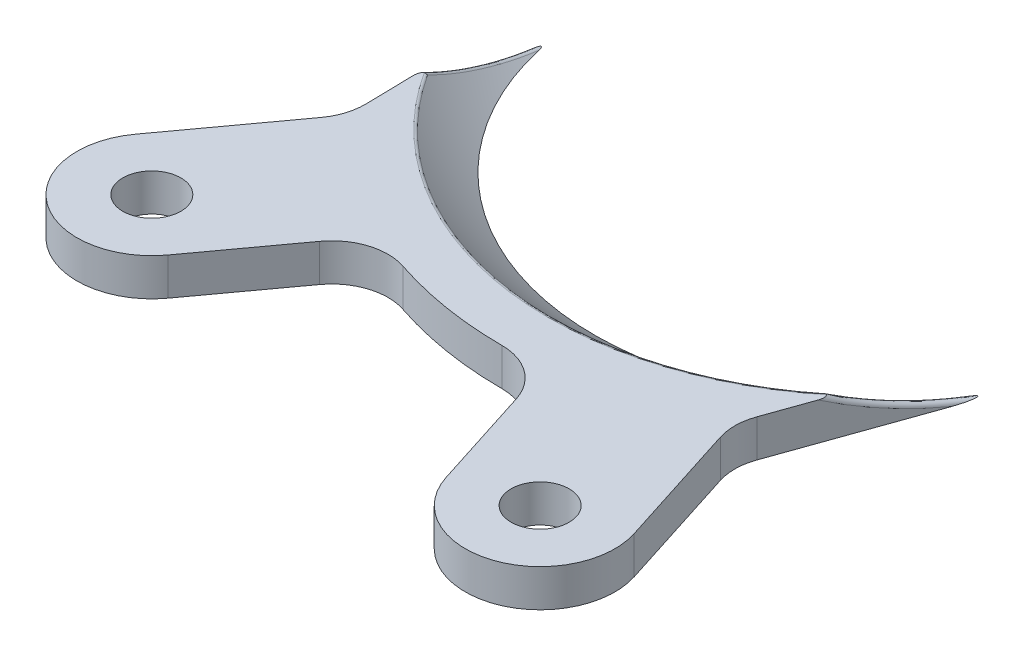
ISO-10303-21;
HEADER;
FILE_DESCRIPTION(('STEP AP214'),'2;1');
FILE_NAME('part.step','',(''),(''),'','','');
FILE_SCHEMA(('AUTOMOTIVE_DESIGN { 1 0 10303 214 1 1 1 1 }'));
ENDSEC;
DATA;
#1=APPLICATION_CONTEXT('core data for automotive mechanical design processes');
#2=APPLICATION_PROTOCOL_DEFINITION('international standard','automotive_design',2000,#1);
#3=PRODUCT_CONTEXT('',#1,'mechanical');
#4=PRODUCT('Part','Part','',(#3));
#5=PRODUCT_RELATED_PRODUCT_CATEGORY('part','',(#4));
#6=PRODUCT_DEFINITION_FORMATION('','',#4);
#7=PRODUCT_DEFINITION_CONTEXT('part definition',#1,'design');
#8=PRODUCT_DEFINITION('design','',#6,#7);
#9=PRODUCT_DEFINITION_SHAPE('','',#8);
#10=(LENGTH_UNIT() NAMED_UNIT(*) SI_UNIT(.MILLI.,.METRE.));
#11=(NAMED_UNIT(*) PLANE_ANGLE_UNIT() SI_UNIT($,.RADIAN.));
#12=(NAMED_UNIT(*) SI_UNIT($,.STERADIAN.) SOLID_ANGLE_UNIT());
#13=UNCERTAINTY_MEASURE_WITH_UNIT(LENGTH_MEASURE(1.E-05),#10,'distance_accuracy_value','');
#14=(GEOMETRIC_REPRESENTATION_CONTEXT(3) GLOBAL_UNCERTAINTY_ASSIGNED_CONTEXT((#13)) GLOBAL_UNIT_ASSIGNED_CONTEXT((#10,
#11,#12)) REPRESENTATION_CONTEXT('',''));
#15=CARTESIAN_POINT('',(0.,0.,0.));
#16=DIRECTION('',(0.,0.,1.));
#17=DIRECTION('',(1.,0.,0.));
#18=AXIS2_PLACEMENT_3D('',#15,#16,#17);
#19=CARTESIAN_POINT('',(-11.920981795953,2.,-8.70254765488495));
#20=DIRECTION('',(0.807679539292025,0.,0.589621710768033));
#21=DIRECTION('',(0.589621710768033,0.,-0.807679539292026));
#22=AXIS2_PLACEMENT_3D('',#19,#20,#21);
#23=PLANE('',#22);
#24=DIRECTION('',(-0.589621710768033,0.,0.807679539292026));
#25=VECTOR('',#24,1.);
#26=CARTESIAN_POINT('',(-11.920981795953,2.,-8.70254765488495));
#27=LINE('',#26,#25);
#28=CARTESIAN_POINT('',(-10.0241295132366,2.,-11.3009064836563));
#29=VERTEX_POINT('',#28);
#30=CARTESIAN_POINT('',(-14.2059725719786,2.,-5.57250636983299));
#31=VERTEX_POINT('',#30);
#32=EDGE_CURVE('E182',#29,#31,#27,.T.);
#33=ORIENTED_EDGE('',*,*,#32,.F.);
#34=DIRECTION('',(0.,-1.,0.));
#35=VECTOR('',#34,1.);
#36=CARTESIAN_POINT('',(-10.0241295132366,2.,-11.3009064836563));
#37=LINE('',#36,#35);
#38=CARTESIAN_POINT('',(-10.0241295132366,0.,-11.3009064836563));
#39=VERTEX_POINT('',#38);
#40=EDGE_CURVE('E213',#29,#39,#37,.T.);
#41=ORIENTED_EDGE('',*,*,#40,.T.);
#42=DIRECTION('',(-0.589621710768033,0.,0.807679539292026));
#43=VECTOR('',#42,1.);
#44=CARTESIAN_POINT('',(-11.920981795953,0.,-8.70254765488495));
#45=LINE('',#44,#43);
#46=CARTESIAN_POINT('',(-14.2059725719786,0.,-5.57250636983299));
#47=VERTEX_POINT('',#46);
#48=EDGE_CURVE('E210',#39,#47,#45,.T.);
#49=ORIENTED_EDGE('',*,*,#48,.T.);
#50=DIRECTION('',(0.,-1.,0.));
#51=VECTOR('',#50,1.);
#52=CARTESIAN_POINT('',(-14.2059725719786,2.,-5.57250636983299));
#53=LINE('',#52,#51);
#54=EDGE_CURVE('E202',#31,#47,#53,.T.);
#55=ORIENTED_EDGE('',*,*,#54,.F.);
#56=EDGE_LOOP('',(#33,#41,#49,#55));
#57=FACE_BOUND('',#56,.T.);
#58=ADVANCED_FACE('F53',(#57),#23,.F.);
#59=CARTESIAN_POINT('',(-10.9752544148105,2.,-3.21401952676085));
#60=DIRECTION('',(0.,-1.,0.));
#61=DIRECTION('',(0.,0.,-1.));
#62=AXIS2_PLACEMENT_3D('',#59,#60,#61);
#63=CYLINDRICAL_SURFACE('',#62,4.00000000000001);
#64=CARTESIAN_POINT('',(-10.9752544148105,0.,-3.21401952676085));
#65=DIRECTION('',(0.,1.,0.));
#66=DIRECTION('',(0.,0.,1.));
#67=AXIS2_PLACEMENT_3D('',#64,#65,#66);
#68=CIRCLE('',#67,4.00000000000001);
#69=CARTESIAN_POINT('',(-7.74453625764238,0.,-0.855532683688701));
#70=VERTEX_POINT('',#69);
#71=EDGE_CURVE('E441',#47,#70,#68,.T.);
#72=ORIENTED_EDGE('',*,*,#71,.T.);
#73=DIRECTION('',(0.,-1.,0.));
#74=VECTOR('',#73,1.);
#75=CARTESIAN_POINT('',(-7.74453625764238,2.,-0.855532683688701));
#76=LINE('',#75,#74);
#77=CARTESIAN_POINT('',(-7.74453625764238,2.,-0.855532683688701));
#78=VERTEX_POINT('',#77);
#79=EDGE_CURVE('E204',#78,#70,#76,.T.);
#80=ORIENTED_EDGE('',*,*,#79,.F.);
#81=CARTESIAN_POINT('',(-10.9752544148105,2.,-3.21401952676085));
#82=DIRECTION('',(0.,1.,0.));
#83=DIRECTION('',(0.,0.,1.));
#84=AXIS2_PLACEMENT_3D('',#81,#82,#83);
#85=CIRCLE('',#84,4.00000000000001);
#86=EDGE_CURVE('E187',#31,#78,#85,.T.);
#87=ORIENTED_EDGE('',*,*,#86,.F.);
#88=ORIENTED_EDGE('',*,*,#54,.T.);
#89=EDGE_LOOP('',(#72,#80,#87,#88));
#90=FACE_BOUND('',#89,.T.);
#91=ADVANCED_FACE('F201',(#90),#63,.T.);
#92=CARTESIAN_POINT('',(-5.45954548161673,2.,-3.98557396874065));
#93=DIRECTION('',(-0.807679539292025,0.,-0.589621710768033));
#94=DIRECTION('',(-0.589621710768033,0.,0.807679539292025));
#95=AXIS2_PLACEMENT_3D('',#92,#93,#94);
#96=PLANE('',#95);
#97=DIRECTION('',(0.589621710768033,0.,-0.807679539292025));
#98=VECTOR('',#97,1.);
#99=CARTESIAN_POINT('',(-5.45954548161673,0.,-3.98557396874065));
#100=LINE('',#99,#98);
#101=CARTESIAN_POINT('',(-4.32997932465112,0.,-5.53288380587244));
#102=VERTEX_POINT('',#101);
#103=EDGE_CURVE('E404',#70,#102,#100,.T.);
#104=ORIENTED_EDGE('',*,*,#103,.T.);
#105=DIRECTION('',(0.,1.,0.));
#106=VECTOR('',#105,1.);
#107=CARTESIAN_POINT('',(-4.32997932465112,2.,-5.53288380587244));
#108=LINE('',#107,#106);
#109=CARTESIAN_POINT('',(-4.32997932465112,2.,-5.53288380587244));
#110=VERTEX_POINT('',#109);
#111=EDGE_CURVE('E243',#102,#110,#108,.T.);
#112=ORIENTED_EDGE('',*,*,#111,.T.);
#113=DIRECTION('',(0.589621710768033,0.,-0.807679539292025));
#114=VECTOR('',#113,1.);
#115=CARTESIAN_POINT('',(-5.45954548161673,2.,-3.98557396874065));
#116=LINE('',#115,#114);
#117=EDGE_CURVE('E207',#78,#110,#116,.T.);
#118=ORIENTED_EDGE('',*,*,#117,.F.);
#119=ORIENTED_EDGE('',*,*,#79,.T.);
#120=EDGE_LOOP('',(#104,#112,#118,#119));
#121=FACE_BOUND('',#120,.T.);
#122=ADVANCED_FACE('F448',(#121),#96,.F.);
#123=CARTESIAN_POINT('',(5.35726697347827,2.,-25.5867427651695));
#124=DIRECTION('',(0.,-1.,0.));
#125=DIRECTION('',(0.,0.,-1.));
#126=AXIS2_PLACEMENT_3D('',#123,#124,#125);
#127=CYLINDRICAL_SURFACE('',#126,20.);
#128=CARTESIAN_POINT('',(5.35726697347827,0.,-25.5867427651695));
#129=DIRECTION('',(0.,1.,0.));
#130=DIRECTION('',(0.,0.,1.));
#131=AXIS2_PLACEMENT_3D('',#128,#129,#130);
#132=CIRCLE('',#131,20.);
#133=CARTESIAN_POINT('',(-0.959435357176782,0.,-6.61046094638588));
#134=VERTEX_POINT('',#133);
#135=CARTESIAN_POINT('',(5.35473098050555,0.,-5.58674292595099));
#136=VERTEX_POINT('',#135);
#137=EDGE_CURVE('E400',#134,#136,#132,.T.);
#138=ORIENTED_EDGE('',*,*,#137,.T.);
#139=DIRECTION('',(0.,-1.,0.));
#140=VECTOR('',#139,1.);
#141=CARTESIAN_POINT('',(5.35473098050555,2.,-5.58674292595099));
#142=LINE('',#141,#140);
#143=CARTESIAN_POINT('',(5.35473098050555,2.,-5.58674292595099));
#144=VERTEX_POINT('',#143);
#145=EDGE_CURVE('E240',#136,#144,#142,.F.);
#146=ORIENTED_EDGE('',*,*,#145,.T.);
#147=CARTESIAN_POINT('',(5.35726697347827,2.,-25.5867427651695));
#148=DIRECTION('',(0.,1.,0.));
#149=DIRECTION('',(0.,0.,1.));
#150=AXIS2_PLACEMENT_3D('',#147,#148,#149);
#151=CIRCLE('',#150,20.);
#152=CARTESIAN_POINT('',(-0.959435357176782,2.,-6.61046094638588));
#153=VERTEX_POINT('',#152);
#154=EDGE_CURVE('E454',#153,#144,#151,.T.);
#155=ORIENTED_EDGE('',*,*,#154,.F.);
#156=DIRECTION('',(0.,-1.,0.));
#157=VECTOR('',#156,1.);
#158=CARTESIAN_POINT('',(-0.959435357176783,2.,-6.61046094638587));
#159=LINE('',#158,#157);
#160=EDGE_CURVE('E236',#153,#134,#159,.T.);
#161=ORIENTED_EDGE('',*,*,#160,.T.);
#162=EDGE_LOOP('',(#138,#146,#155,#161));
#163=FACE_BOUND('',#162,.T.);
#164=ADVANCED_FACE('F457',(#163),#127,.T.);
#165=CARTESIAN_POINT('',(8.46623721619208,2.,-2.70382058589086));
#166=DIRECTION('',(-0.952599553113903,0.,0.304227039244038));
#167=DIRECTION('',(0.304227039244038,0.,0.952599553113903));
#168=AXIS2_PLACEMENT_3D('',#165,#166,#167);
#169=PLANE('',#168);
#170=DIRECTION('',(-0.304227039244038,0.,-0.952599553113902));
#171=VECTOR('',#170,1.);
#172=CARTESIAN_POINT('',(8.46623721619208,2.,-2.70382058589086));
#173=LINE('',#172,#171);
#174=CARTESIAN_POINT('',(9.97395774809266,2.,2.01717301309372));
#175=VERTEX_POINT('',#174);
#176=CARTESIAN_POINT('',(8.21214924090135,2.,-3.49942406780033));
#177=VERTEX_POINT('',#176);
#178=EDGE_CURVE('E461',#175,#177,#173,.T.);
#179=ORIENTED_EDGE('',*,*,#178,.T.);
#180=DIRECTION('',(0.,-1.,0.));
#181=VECTOR('',#180,1.);
#182=CARTESIAN_POINT('',(8.21214924090135,2.,-3.49942406780033));
#183=LINE('',#182,#181);
#184=CARTESIAN_POINT('',(8.21214924090135,0.,-3.49942406780033));
#185=VERTEX_POINT('',#184);
#186=EDGE_CURVE('E232',#177,#185,#183,.T.);
#187=ORIENTED_EDGE('',*,*,#186,.T.);
#188=DIRECTION('',(-0.304227039244038,0.,-0.952599553113902));
#189=VECTOR('',#188,1.);
#190=CARTESIAN_POINT('',(8.46623721619208,0.,-2.70382058589086));
#191=LINE('',#190,#189);
#192=CARTESIAN_POINT('',(9.97395774809266,0.,2.01717301309372));
#193=VERTEX_POINT('',#192);
#194=EDGE_CURVE('E393',#193,#185,#191,.T.);
#195=ORIENTED_EDGE('',*,*,#194,.F.);
#196=DIRECTION('',(0.,-1.,0.));
#197=VECTOR('',#196,1.);
#198=CARTESIAN_POINT('',(9.97395774809266,2.,2.01717301309372));
#199=LINE('',#198,#197);
#200=EDGE_CURVE('E219',#175,#193,#199,.T.);
#201=ORIENTED_EDGE('',*,*,#200,.F.);
#202=EDGE_LOOP('',(#179,#187,#195,#201));
#203=FACE_BOUND('',#202,.T.);
#204=ADVANCED_FACE('F397',(#203),#169,.T.);
#205=CARTESIAN_POINT('',(13.7843559605483,2.,0.800264856117561));
#206=DIRECTION('',(0.,-1.,0.));
#207=DIRECTION('',(0.,0.,-1.));
#208=AXIS2_PLACEMENT_3D('',#205,#206,#207);
#209=CYLINDRICAL_SURFACE('',#208,4.00000000000002);
#210=CARTESIAN_POINT('',(13.7843559605483,0.,0.800264856117561));
#211=DIRECTION('',(0.,1.,0.));
#212=DIRECTION('',(0.,0.,1.));
#213=AXIS2_PLACEMENT_3D('',#210,#211,#212);
#214=CIRCLE('',#213,4.00000000000002);
#215=CARTESIAN_POINT('',(17.5947541730039,0.,-0.416643300858593));
#216=VERTEX_POINT('',#215);
#217=EDGE_CURVE('E385',#193,#216,#214,.T.);
#218=ORIENTED_EDGE('',*,*,#217,.T.);
#219=DIRECTION('',(0.,-1.,0.));
#220=VECTOR('',#219,1.);
#221=CARTESIAN_POINT('',(17.5947541730039,2.,-0.416643300858593));
#222=LINE('',#221,#220);
#223=CARTESIAN_POINT('',(17.5947541730039,2.,-0.416643300858593));
#224=VERTEX_POINT('',#223);
#225=EDGE_CURVE('E375',#224,#216,#222,.T.);
#226=ORIENTED_EDGE('',*,*,#225,.F.);
#227=CARTESIAN_POINT('',(13.7843559605483,2.,0.800264856117561));
#228=DIRECTION('',(0.,1.,0.));
#229=DIRECTION('',(0.,0.,1.));
#230=AXIS2_PLACEMENT_3D('',#227,#228,#229);
#231=CIRCLE('',#230,4.00000000000002);
#232=EDGE_CURVE('E386',#175,#224,#231,.T.);
#233=ORIENTED_EDGE('',*,*,#232,.F.);
#234=ORIENTED_EDGE('',*,*,#200,.T.);
#235=EDGE_LOOP('',(#218,#226,#233,#234));
#236=FACE_BOUND('',#235,.T.);
#237=ADVANCED_FACE('F383',(#236),#209,.T.);
#238=CARTESIAN_POINT('',(16.0870336411034,2.,-5.13763689984319));
#239=DIRECTION('',(-0.952599553113902,0.,0.304227039244038));
#240=DIRECTION('',(0.304227039244038,0.,0.952599553113902));
#241=AXIS2_PLACEMENT_3D('',#238,#239,#240);
#242=PLANE('',#241);
#243=DIRECTION('',(-0.304227039244038,0.,-0.952599553113903));
#244=VECTOR('',#243,1.);
#245=CARTESIAN_POINT('',(16.0870336411034,0.,-5.13763689984319));
#246=LINE('',#245,#244);
#247=CARTESIAN_POINT('',(15.437049140927,0.,-7.17287658773398));
#248=VERTEX_POINT('',#247);
#249=EDGE_CURVE('E365',#216,#248,#246,.T.);
#250=ORIENTED_EDGE('',*,*,#249,.T.);
#251=DIRECTION('',(0.,-1.,0.));
#252=VECTOR('',#251,1.);
#253=CARTESIAN_POINT('',(15.437049140927,2.,-7.17287658773397));
#254=LINE('',#253,#252);
#255=CARTESIAN_POINT('',(15.437049140927,2.,-7.17287658773398));
#256=VERTEX_POINT('',#255);
#257=EDGE_CURVE('E229',#248,#256,#254,.F.);
#258=ORIENTED_EDGE('',*,*,#257,.T.);
#259=DIRECTION('',(-0.304227039244038,0.,-0.952599553113903));
#260=VECTOR('',#259,1.);
#261=CARTESIAN_POINT('',(16.0870336411034,2.,-5.13763689984319));
#262=LINE('',#261,#260);
#263=EDGE_CURVE('E419',#224,#256,#262,.T.);
#264=ORIENTED_EDGE('',*,*,#263,.F.);
#265=ORIENTED_EDGE('',*,*,#225,.T.);
#266=EDGE_LOOP('',(#250,#258,#264,#265));
#267=FACE_BOUND('',#266,.T.);
#268=ADVANCED_FACE('F410',(#267),#242,.F.);
#269=CARTESIAN_POINT('',(10.8669421285882,2.,3.86073627490867));
#270=DIRECTION('',(-0.942298562553958,0.,-0.334773683267881));
#271=DIRECTION('',(-0.334773683267881,0.,0.942298562553959));
#272=AXIS2_PLACEMENT_3D('',#269,#270,#271);
#273=PLANE('',#272);
#274=DIRECTION('',(0.334773683267881,0.,-0.942298562553959));
#275=VECTOR('',#274,1.);
#276=CARTESIAN_POINT('',(10.8669421285882,0.,3.86073627490867));
#277=LINE('',#276,#275);
#278=CARTESIAN_POINT('',(15.4679521126068,0.,-9.08987875526974));
#279=VERTEX_POINT('',#278);
#280=CARTESIAN_POINT('',(18.1984266465281,0.,-16.7754357658709));
#281=VERTEX_POINT('',#280);
#282=EDGE_CURVE('E359',#279,#281,#277,.T.);
#283=ORIENTED_EDGE('',*,*,#282,.T.);
#284=CARTESIAN_POINT('',(19.5388603399153,20.,-20.5483988319879));
#285=DIRECTION('',(-0.942298562553958,0.,-0.334773683267881));
#286=DIRECTION('',(-0.334773683267881,0.,0.942298562553959));
#287=AXIS2_PLACEMENT_3D('',#284,#285,#286);
#288=CIRCLE('',#287,20.3968628172239);
#289=CARTESIAN_POINT('',(16.3272653575068,2.,-11.5086161767679));
#290=VERTEX_POINT('',#289);
#291=EDGE_CURVE('E11',#281,#290,#288,.T.);
#292=ORIENTED_EDGE('',*,*,#291,.T.);
#293=DIRECTION('',(0.334773683267881,0.,-0.942298562553959));
#294=VECTOR('',#293,1.);
#295=CARTESIAN_POINT('',(10.8669421285882,2.,3.86073627490867));
#296=LINE('',#295,#294);
#297=CARTESIAN_POINT('',(15.4679521126068,2.,-9.08987875526974));
#298=VERTEX_POINT('',#297);
#299=EDGE_CURVE('E418',#298,#290,#296,.T.);
#300=ORIENTED_EDGE('',*,*,#299,.F.);
#301=DIRECTION('',(0.,-1.,0.));
#302=VECTOR('',#301,1.);
#303=CARTESIAN_POINT('',(15.4679521126068,0.,-9.08987875526973));
#304=LINE('',#303,#302);
#305=EDGE_CURVE('E225',#298,#279,#304,.T.);
#306=ORIENTED_EDGE('',*,*,#305,.T.);
#307=EDGE_LOOP('',(#283,#292,#300,#306));
#308=FACE_BOUND('',#307,.T.);
#309=ADVANCED_FACE('F421',(#308),#273,.F.);
#310=CARTESIAN_POINT('',(13.7843559605483,2.,0.800264856117561));
#311=DIRECTION('',(0.,-1.,0.));
#312=DIRECTION('',(0.,0.,-1.));
#313=AXIS2_PLACEMENT_3D('',#310,#311,#312);
#314=CYLINDRICAL_SURFACE('',#313,1.55);
#315=CARTESIAN_POINT('',(13.7843559605483,2.,0.800264856117561));
#316=DIRECTION('',(0.,1.,0.));
#317=DIRECTION('',(0.,0.,1.));
#318=AXIS2_PLACEMENT_3D('',#315,#316,#317);
#319=CIRCLE('',#318,1.55);
#320=CARTESIAN_POINT('',(13.7843559605483,2.,2.35026485611756));
#321=VERTEX_POINT('',#320);
#322=EDGE_CURVE('E428',#321,#321,#319,.T.);
#323=ORIENTED_EDGE('',*,*,#322,.T.);
#324=EDGE_LOOP('',(#323));
#325=FACE_BOUND('',#324,.T.);
#326=CARTESIAN_POINT('',(13.7843559605483,0.,0.800264856117561));
#327=DIRECTION('',(0.,1.,0.));
#328=DIRECTION('',(0.,0.,1.));
#329=AXIS2_PLACEMENT_3D('',#326,#327,#328);
#330=CIRCLE('',#329,1.55);
#331=CARTESIAN_POINT('',(13.7843559605483,0.,2.35026485611756));
#332=VERTEX_POINT('',#331);
#333=EDGE_CURVE('E363',#332,#332,#330,.T.);
#334=ORIENTED_EDGE('',*,*,#333,.F.);
#335=EDGE_LOOP('',(#334));
#336=FACE_BOUND('',#335,.T.);
#337=ADVANCED_FACE('F497',(#325,#336),#314,.F.);
#338=CARTESIAN_POINT('',(-9.18279284805776,2.,0.182775951464731));
#339=DIRECTION('',(-0.999801970670517,0.,0.0199002372686941));
#340=DIRECTION('',(0.0199002372686941,0.,0.999801970670517));
#341=AXIS2_PLACEMENT_3D('',#338,#339,#340);
#342=PLANE('',#341);
#343=DIRECTION('',(-0.0199002372686941,0.,-0.999801970670517));
#344=VECTOR('',#343,1.);
#345=CARTESIAN_POINT('',(-9.18279284805776,2.,0.182775951464731));
#346=LINE('',#345,#344);
#347=CARTESIAN_POINT('',(-9.44776221910111,2.,-13.1294723277665));
#348=VERTEX_POINT('',#347);
#349=CARTESIAN_POINT('',(-9.49884310841927,2.,-15.6958122720767));
#350=VERTEX_POINT('',#349);
#351=EDGE_CURVE('E424',#348,#350,#346,.T.);
#352=ORIENTED_EDGE('',*,*,#351,.T.);
#353=CARTESIAN_POINT('',(-9.68975268511302,20.,-25.2872441942756));
#354=DIRECTION('',(-0.999801970670517,0.,0.0199002372686941));
#355=DIRECTION('',(0.0199002372686941,0.,0.999801970670517));
#356=AXIS2_PLACEMENT_3D('',#353,#354,#355);
#357=CIRCLE('',#356,20.3968628172239);
#358=CARTESIAN_POINT('',(-9.61007214307945,0.,-21.2840375051486));
#359=VERTEX_POINT('',#358);
#360=EDGE_CURVE('E84',#350,#359,#357,.F.);
#361=ORIENTED_EDGE('',*,*,#360,.T.);
#362=DIRECTION('',(-0.0199002372686941,0.,-0.999801970670517));
#363=VECTOR('',#362,1.);
#364=CARTESIAN_POINT('',(-9.18279284805776,0.,0.182775951464731));
#365=LINE('',#364,#363);
#366=CARTESIAN_POINT('',(-9.44776221910111,0.,-13.1294723277665));
#367=VERTEX_POINT('',#366);
#368=EDGE_CURVE('E355',#367,#359,#365,.T.);
#369=ORIENTED_EDGE('',*,*,#368,.F.);
#370=DIRECTION('',(0.,-1.,0.));
#371=VECTOR('',#370,1.);
#372=CARTESIAN_POINT('',(-9.44776221910111,2.,-13.1294723277665));
#373=LINE('',#372,#371);
#374=EDGE_CURVE('E217',#367,#348,#373,.F.);
#375=ORIENTED_EDGE('',*,*,#374,.T.);
#376=EDGE_LOOP('',(#352,#361,#369,#375));
#377=FACE_BOUND('',#376,.T.);
#378=ADVANCED_FACE('F495',(#377),#342,.T.);
#379=CARTESIAN_POINT('',(-10.9752544148105,2.,-3.21401952676085));
#380=DIRECTION('',(0.,-1.,0.));
#381=DIRECTION('',(0.,0.,-1.));
#382=AXIS2_PLACEMENT_3D('',#379,#380,#381);
#383=CYLINDRICAL_SURFACE('',#382,1.55);
#384=CARTESIAN_POINT('',(-10.9752544148105,2.,-3.21401952676085));
#385=DIRECTION('',(0.,1.,0.));
#386=DIRECTION('',(0.,0.,1.));
#387=AXIS2_PLACEMENT_3D('',#384,#385,#386);
#388=CIRCLE('',#387,1.55);
#389=CARTESIAN_POINT('',(-10.9752544148105,2.,-1.66401952676085));
#390=VERTEX_POINT('',#389);
#391=EDGE_CURVE('E378',#390,#390,#388,.T.);
#392=ORIENTED_EDGE('',*,*,#391,.T.);
#393=EDGE_LOOP('',(#392));
#394=FACE_BOUND('',#393,.T.);
#395=CARTESIAN_POINT('',(-10.9752544148105,0.,-3.21401952676085));
#396=DIRECTION('',(0.,1.,0.));
#397=DIRECTION('',(0.,0.,1.));
#398=AXIS2_PLACEMENT_3D('',#395,#396,#397);
#399=CIRCLE('',#398,1.55);
#400=CARTESIAN_POINT('',(-10.9752544148105,0.,-1.66401952676085));
#401=VERTEX_POINT('',#400);
#402=EDGE_CURVE('E197',#401,#401,#399,.T.);
#403=ORIENTED_EDGE('',*,*,#402,.F.);
#404=EDGE_LOOP('',(#403));
#405=FACE_BOUND('',#404,.T.);
#406=ADVANCED_FACE('F294',(#394,#405),#383,.F.);
#407=CARTESIAN_POINT('',(0.,2.,0.));
#408=DIRECTION('',(0.,1.,0.));
#409=DIRECTION('',(0.,0.,1.));
#410=AXIS2_PLACEMENT_3D('',#407,#408,#409);
#411=PLANE('',#410);
#412=CARTESIAN_POINT('',(5.35726697347827,2.,-25.5867427651695));
#413=DIRECTION('',(0.,1.,0.));
#414=DIRECTION('',(0.,0.,1.));
#415=AXIS2_PLACEMENT_3D('',#412,#413,#414);
#416=CIRCLE('',#415,17.4732513512698);
#417=CARTESIAN_POINT('',(16.3078759594765,2.,-11.9706245363781));
#418=VERTEX_POINT('',#417);
#419=CARTESIAN_POINT('',(-9.3344729041808,2.,-16.1280276224108));
#420=VERTEX_POINT('',#419);
#421=EDGE_CURVE('E287',#418,#420,#416,.F.);
#422=ORIENTED_EDGE('',*,*,#421,.T.);
#423=CARTESIAN_POINT('',(-9.33447290418082,2.,-16.1280276224107));
#424=CARTESIAN_POINT('',(-9.34141527698466,2.,-16.1257873859322));
#425=CARTESIAN_POINT('',(-9.34805630452247,2.,-16.1228104214461));
#426=CARTESIAN_POINT('',(-9.36061396150703,2.,-16.1157756382995));
#427=CARTESIAN_POINT('',(-9.36654019567871,2.,-16.1117352249369));
#428=CARTESIAN_POINT('',(-9.38043844353494,2.,-16.1007634159035));
#429=CARTESIAN_POINT('',(-9.38803814579231,2.,-16.0933722682942));
#430=CARTESIAN_POINT('',(-9.40210676357205,2.,-16.0775082286985));
#431=CARTESIAN_POINT('',(-9.40856540549543,2.,-16.0690265903809));
#432=CARTESIAN_POINT('',(-9.42594325555545,2.,-16.0433948494577));
#433=CARTESIAN_POINT('',(-9.43557252912392,2.,-16.0253806907412));
#434=CARTESIAN_POINT('',(-9.45230896759749,2.,-15.9882194492302));
#435=CARTESIAN_POINT('',(-9.45940690317655,2.,-15.9690685117197));
#436=CARTESIAN_POINT('',(-9.47200842894899,2.,-15.9288962458683));
#437=CARTESIAN_POINT('',(-9.47737979208243,2.,-15.9078339172087));
#438=CARTESIAN_POINT('',(-9.48625727690297,2.,-15.8652969774722));
#439=CARTESIAN_POINT('',(-9.48976035203805,2.,-15.8438217518073));
#440=CARTESIAN_POINT('',(-9.49502755155161,2.,-15.8012509548801));
#441=CARTESIAN_POINT('',(-9.49683603017613,2.,-15.7801607664213));
#442=CARTESIAN_POINT('',(-9.49894424949254,2.,-15.7379778622413));
#443=CARTESIAN_POINT('',(-9.49924922331218,2.,-15.716885411187));
#444=CARTESIAN_POINT('',(-9.49884310841927,2.,-15.6958122720767));
#445=B_SPLINE_CURVE_WITH_KNOTS('',3,(#423,#424,#425,#426,#427,#428,#429,#430,#431,#432,#433,
#434,#435,#436,#437,#438,#439,#440,#441,#442,#443,#444),.UNSPECIFIED.,.F.,.F.,(4,2,2,2,2,2,2,2,
2,2,4),(0.,0.0217537107381088,0.0431714102594458,0.0748039163929338,0.106708130038567,
0.167648014139011,0.228807868273761,0.293909184404337,0.359116336886793,0.422564734080327,
0.485792134878997),.UNSPECIFIED.);
#446=EDGE_CURVE('E300',#420,#350,#445,.T.);
#447=ORIENTED_EDGE('',*,*,#446,.T.);
#448=ORIENTED_EDGE('',*,*,#351,.F.);
#449=CARTESIAN_POINT('',(-12.4471681311127,2.,-13.0697716159604));
#450=DIRECTION('',(0.,1.,0.));
#451=DIRECTION('',(0.,0.,1.));
#452=AXIS2_PLACEMENT_3D('',#449,#450,#451);
#453=CIRCLE('',#452,3.);
#454=EDGE_CURVE('E191',#348,#29,#453,.F.);
#455=ORIENTED_EDGE('',*,*,#454,.T.);
#456=ORIENTED_EDGE('',*,*,#32,.T.);
#457=ORIENTED_EDGE('',*,*,#86,.T.);
#458=ORIENTED_EDGE('',*,*,#117,.T.);
#459=CARTESIAN_POINT('',(-1.90694070677504,2.,-3.76401867356834));
#460=DIRECTION('',(0.,1.,0.));
#461=DIRECTION('',(0.,0.,1.));
#462=AXIS2_PLACEMENT_3D('',#459,#460,#461);
#463=CIRCLE('',#462,3.);
#464=EDGE_CURVE('E266',#110,#153,#463,.F.);
#465=ORIENTED_EDGE('',*,*,#464,.T.);
#466=ORIENTED_EDGE('',*,*,#154,.T.);
#467=CARTESIAN_POINT('',(5.35435058155964,2.,-2.58674295006821));
#468=DIRECTION('',(0.,1.,0.));
#469=DIRECTION('',(0.,0.,1.));
#470=AXIS2_PLACEMENT_3D('',#467,#468,#469);
#471=CIRCLE('',#470,3.);
#472=EDGE_CURVE('E260',#144,#177,#471,.F.);
#473=ORIENTED_EDGE('',*,*,#472,.T.);
#474=ORIENTED_EDGE('',*,*,#178,.F.);
#475=ORIENTED_EDGE('',*,*,#232,.T.);
#476=ORIENTED_EDGE('',*,*,#263,.T.);
#477=CARTESIAN_POINT('',(18.2948478002687,2.,-8.08555770546609));
#478=DIRECTION('',(0.,1.,0.));
#479=DIRECTION('',(0.,0.,1.));
#480=AXIS2_PLACEMENT_3D('',#477,#478,#479);
#481=CIRCLE('',#480,3.);
#482=EDGE_CURVE('E254',#256,#298,#481,.F.);
#483=ORIENTED_EDGE('',*,*,#482,.T.);
#484=ORIENTED_EDGE('',*,*,#299,.T.);
#485=CARTESIAN_POINT('',(16.3272653575068,1.99999999999994,-11.5086161767679));
#486=CARTESIAN_POINT('',(16.3351520197515,1.99999999999998,-11.5308800192846));
#487=CARTESIAN_POINT('',(16.3422093815723,1.99999999999999,-11.5534501469463));
#488=CARTESIAN_POINT('',(16.3545342080895,2.00000000000001,-11.5992170312906));
#489=CARTESIAN_POINT('',(16.3597907165364,2.,-11.6224167281532));
#490=CARTESIAN_POINT('',(16.3682932895891,2.,-11.6692381530195));
#491=CARTESIAN_POINT('',(16.371534983953,2.,-11.6928606848699));
#492=CARTESIAN_POINT('',(16.3755894937381,2.,-11.7402764787916));
#493=CARTESIAN_POINT('',(16.3764090523162,2.,-11.7640690816718));
#494=CARTESIAN_POINT('',(16.3752096701748,2.,-11.8008155002922));
#495=CARTESIAN_POINT('',(16.3743067236802,2.,-11.8138053271297));
#496=CARTESIAN_POINT('',(16.3713090046805,2.,-11.8397217270869));
#497=CARTESIAN_POINT('',(16.3692084631317,2.,-11.8526476862838));
#498=CARTESIAN_POINT('',(16.3634338128639,2.,-11.8783603620144));
#499=CARTESIAN_POINT('',(16.3597366334642,2.,-11.8911421025508));
#500=CARTESIAN_POINT('',(16.350253909535,2.,-11.9158057582417));
#501=CARTESIAN_POINT('',(16.3444940061011,2.,-11.9276966438864));
#502=CARTESIAN_POINT('',(16.3333743241609,2.,-11.944733115782));
#503=CARTESIAN_POINT('',(16.3290010764277,2.,-11.9505060115779));
#504=CARTESIAN_POINT('',(16.3192317932244,2.,-11.9612759634532));
#505=CARTESIAN_POINT('',(16.3138198337288,2.,-11.9662583832068));
#506=CARTESIAN_POINT('',(16.3078759594754,2.,-11.9706245363773));
#507=B_SPLINE_CURVE_WITH_KNOTS('',3,(#485,#486,#487,#488,#489,#490,#491,#492,#493,#494,#495,
#496,#497,#498,#499,#500,#501,#502,#503,#504,#505,#506),.UNSPECIFIED.,.F.,.F.,(4,2,2,2,2,2,2,2,
2,2,4),(0.,0.0708598606895454,0.142143474329066,0.213581171311311,0.284819799560907,
0.323843907507055,0.363057609829118,0.402857954860216,0.442179812423486,0.463805136409028,
0.485793160923156),.UNSPECIFIED.);
#508=EDGE_CURVE('E279',#290,#418,#507,.T.);
#509=ORIENTED_EDGE('',*,*,#508,.T.);
#510=EDGE_LOOP('',(#422,#447,#448,#455,#456,#457,#458,#465,#466,#473,#474,#475,#476,#483,#484,#509));
#511=FACE_BOUND('',#510,.T.);
#512=ORIENTED_EDGE('',*,*,#322,.F.);
#513=EDGE_LOOP('',(#512));
#514=FACE_BOUND('',#513,.T.);
#515=ORIENTED_EDGE('',*,*,#391,.F.);
#516=EDGE_LOOP('',(#515));
#517=FACE_BOUND('',#516,.T.);
#518=ADVANCED_FACE('F184',(#511,#514,#517),#411,.T.);
#519=CARTESIAN_POINT('',(0.,0.,0.));
#520=DIRECTION('',(0.,1.,0.));
#521=DIRECTION('',(0.,0.,1.));
#522=AXIS2_PLACEMENT_3D('',#519,#520,#521);
#523=PLANE('',#522);
#524=CARTESIAN_POINT('',(-8.02714586097035,0.,-7.25241722322098));
#525=DIRECTION('',(0.,-1.,0.));
#526=DIRECTION('',(0.,0.,-1.));
#527=AXIS2_PLACEMENT_3D('',#524,#525,#526);
#528=CIRCLE('',#527,0.75);
#529=CARTESIAN_POINT('',(-8.02714586097035,0.,-8.00241722322098));
#530=VERTEX_POINT('',#529);
#531=EDGE_CURVE('E692',#530,#530,#528,.T.);
#532=ORIENTED_EDGE('',*,*,#531,.F.);
#533=EDGE_LOOP('',(#532));
#534=FACE_BOUND('',#533,.T.);
#535=ORIENTED_EDGE('',*,*,#368,.T.);
#536=CARTESIAN_POINT('',(-9.61007214307945,0.,-21.2840375051486));
#537=CARTESIAN_POINT('',(-9.61073219792931,0.,-21.3172965883992));
#538=CARTESIAN_POINT('',(-9.61107676681869,0.,-21.3505604486173));
#539=CARTESIAN_POINT('',(-9.61116222411056,0.,-21.4170904620119));
#540=CARTESIAN_POINT('',(-9.61090308647104,0.,-21.4503566152255));
#541=CARTESIAN_POINT('',(-9.60925470843091,0.,-21.5505263525505));
#542=CARTESIAN_POINT('',(-9.60698749168412,0.,-21.6174179971657));
#543=CARTESIAN_POINT('',(-9.60118654191378,0.,-21.7300766551828));
#544=CARTESIAN_POINT('',(-9.5982746134678,0.,-21.7758770500063));
#545=CARTESIAN_POINT('',(-9.59125242984606,0.,-21.8674003274757));
#546=CARTESIAN_POINT('',(-9.58714186814956,0.,-21.9131231872819));
#547=CARTESIAN_POINT('',(-9.57752802345311,0.,-22.0042261404894));
#548=CARTESIAN_POINT('',(-9.57203073596416,0.,-22.049606864708));
#549=CARTESIAN_POINT('',(-9.55921334399575,0.,-22.1401004709295));
#550=CARTESIAN_POINT('',(-9.55189429823601,0.,-22.1852134929721));
#551=CARTESIAN_POINT('',(-9.539356307672,0.,-22.2489076522065));
#552=CARTESIAN_POINT('',(-9.53537481164345,0.,-22.2677279717615));
#553=CARTESIAN_POINT('',(-9.52663425183715,0.,-22.3052910793828));
#554=CARTESIAN_POINT('',(-9.52187118841265,0.,-22.3240329314908));
#555=CARTESIAN_POINT('',(-9.51116900409868,0.,-22.3613955665386));
#556=CARTESIAN_POINT('',(-9.5052194326862,0.,-22.3800136347828));
#557=CARTESIAN_POINT('',(-9.4946668482949,0.,-22.407261714479));
#558=CARTESIAN_POINT('',(-9.49088930888366,0.,-22.4162098937993));
#559=CARTESIAN_POINT('',(-9.48248484941069,0.,-22.4336902418226));
#560=CARTESIAN_POINT('',(-9.47786177141725,0.,-22.4422240798201));
#561=CARTESIAN_POINT('',(-9.4699839760808,0.,-22.4538921038064));
#562=CARTESIAN_POINT('',(-9.46735182494822,0.,-22.4574394831467));
#563=CARTESIAN_POINT('',(-9.46162141649951,0.,-22.4641273811397));
#564=CARTESIAN_POINT('',(-9.45852623073983,0.,-22.4672703444081));
#565=CARTESIAN_POINT('',(-9.45360743790026,0.,-22.4712277895604));
#566=CARTESIAN_POINT('',(-9.45204290454203,0.,-22.4723603121337));
#567=CARTESIAN_POINT('',(-9.448775789051,0.,-22.4744123473052));
#568=CARTESIAN_POINT('',(-9.44707314853039,0.,-22.4753317691703));
#569=CARTESIAN_POINT('',(-9.4435126675807,0.,-22.4768916394684));
#570=CARTESIAN_POINT('',(-9.44165301689695,0.,-22.4775280833486));
#571=CARTESIAN_POINT('',(-9.43784573908748,0.,-22.4784201417215));
#572=CARTESIAN_POINT('',(-9.43589834432882,0.,-22.4786767074273));
#573=CARTESIAN_POINT('',(-9.4322432243367,0.,-22.4787675518967));
#574=CARTESIAN_POINT('',(-9.43053658777026,0.,-22.4786514864361));
#575=CARTESIAN_POINT('',(-9.42716939225235,0.,-22.4781221311138));
#576=CARTESIAN_POINT('',(-9.425508900031,0.,-22.4777084319295));
#577=CARTESIAN_POINT('',(-9.42178500122495,0.,-22.476468905512));
#578=CARTESIAN_POINT('',(-9.41975093480125,0.,-22.4755564615071));
#579=CARTESIAN_POINT('',(-9.41585145227256,0.,-22.4734263182353));
#580=CARTESIAN_POINT('',(-9.41398639477894,0.,-22.4722079896557));
#581=CARTESIAN_POINT('',(-9.40894053069619,0.,-22.468471440779));
#582=CARTESIAN_POINT('',(-9.40594287238431,0.,-22.4657097269261));
#583=CARTESIAN_POINT('',(-9.4003452381058,0.,-22.4598105476828));
#584=CARTESIAN_POINT('',(-9.3977467901217,0.,-22.4566717166931));
#585=CARTESIAN_POINT('',(-9.38700397981179,0.,-22.4425228028372));
#586=CARTESIAN_POINT('',(-9.38028834149781,0.,-22.4304648855454));
#587=CARTESIAN_POINT('',(-9.36817124966172,0.,-22.405670929651));
#588=CARTESIAN_POINT('',(-9.36278392678879,0.,-22.3929292206014));
#589=CARTESIAN_POINT('',(-9.35266211113903,0.,-22.3666210181589));
#590=CARTESIAN_POINT('',(-9.34795999855908,0.,-22.3530415545128));
#591=CARTESIAN_POINT('',(-9.33914676534853,0.,-22.3256851662638));
#592=CARTESIAN_POINT('',(-9.33503632704721,0.,-22.3119080335151));
#593=CARTESIAN_POINT('',(-9.3274172226571,0.,-22.2848166044862));
#594=CARTESIAN_POINT('',(-9.32389044783041,0.,-22.2715074051599));
#595=CARTESIAN_POINT('',(-9.31716428370002,0.,-22.2448353874009));
#596=CARTESIAN_POINT('',(-9.31396423404557,0.,-22.2314727362154));
#597=CARTESIAN_POINT('',(-9.31088381532121,0.,-22.2180854010208));
#598=B_SPLINE_CURVE_WITH_KNOTS('',3,(#536,#537,#538,#539,#540,#541,#542,#543,#544,#545,#546,
#547,#548,#549,#550,#551,#552,#553,#554,#555,#556,#557,#558,#559,#560,#561,#562,#563,#564,#565,
#566,#567,#568,#569,#570,#571,#572,#573,#574,#575,#576,#577,#578,#579,#580,#581,#582,#583,#584,
#585,#586,#587,#588,#589,#590,#591,#592,#593,#594,#595,#596,#597),.UNSPECIFIED.,.F.,.F.,(4,2,2,
2,2,2,2,2,2,2,2,2,2,2,2,2,2,2,2,2,2,2,2,2,2,2,2,2,2,2,4),(0.,0.0997927289627841,
0.199589762750846,0.400333057670879,0.537999690849979,0.675701559775963,0.812817983715224,
0.949854907372096,1.00755254651351,1.06555522823332,1.12409334356435,1.15321839095897,
1.18221424357144,1.1954457069833,1.20859300102842,1.21437477152082,1.22015899925149,
1.22602266201155,1.23187161720999,1.23697507667593,1.24208556815294,1.24873581624176,
1.25539985999176,1.26755885031279,1.27976327822507,1.32085126359202,1.36235911842933,
1.40543618931363,1.44856254614307,1.48986320755408,1.53107867041867),.UNSPECIFIED.);
#599=CARTESIAN_POINT('',(-9.31088381532145,0.,-22.2180854010207));
#600=VERTEX_POINT('',#599);
#601=EDGE_CURVE('E68',#359,#600,#598,.T.);
#602=ORIENTED_EDGE('',*,*,#601,.T.);
#603=CARTESIAN_POINT('',(5.35726697347827,0.,-25.5867427651695));
#604=DIRECTION('',(0.,1.,0.));
#605=DIRECTION('',(0.,0.,1.));
#606=AXIS2_PLACEMENT_3D('',#603,#604,#605);
#607=CIRCLE('',#606,15.05);
#608=CARTESIAN_POINT('',(18.2096820277284,0.,-17.7561663321548));
#609=VERTEX_POINT('',#608);
#610=EDGE_CURVE('E354',#600,#609,#607,.T.);
#611=ORIENTED_EDGE('',*,*,#610,.T.);
#612=CARTESIAN_POINT('',(18.2096820277284,0.,-17.7561663321548));
#613=CARTESIAN_POINT('',(18.2204993138694,0.,-17.7738604705738));
#614=CARTESIAN_POINT('',(18.2315243631095,0.,-17.7914304214722));
#615=CARTESIAN_POINT('',(18.2547788665041,0.,-17.8268380142901));
#616=CARTESIAN_POINT('',(18.2670396751509,0.,-17.8446549181384));
#617=CARTESIAN_POINT('',(18.2926825207344,0.,-17.879516011714));
#618=CARTESIAN_POINT('',(18.3060645090002,0.,-17.8965602349342));
#619=CARTESIAN_POINT('',(18.3276363972582,0.,-17.9205368753353));
#620=CARTESIAN_POINT('',(18.3350087480062,0.,-17.9282061141267));
#621=CARTESIAN_POINT('',(18.350560671714,0.,-17.9426620358233));
#622=CARTESIAN_POINT('',(18.3587339850192,0.,-17.9494547308322));
#623=CARTESIAN_POINT('',(18.3706890794187,0.,-17.9570600698408));
#624=CARTESIAN_POINT('',(18.3738209696271,0.,-17.9588662375785));
#625=CARTESIAN_POINT('',(18.3802958069065,0.,-17.9620448466316));
#626=CARTESIAN_POINT('',(18.3836378431975,0.,-17.9634190231157));
#627=CARTESIAN_POINT('',(18.388953187171,0.,-17.9649982155656));
#628=CARTESIAN_POINT('',(18.3908516206788,0.,-17.9654504163441));
#629=CARTESIAN_POINT('',(18.3946956861404,0.,-17.9660830282543));
#630=CARTESIAN_POINT('',(18.3966412853588,0.,-17.9662636227007));
#631=CARTESIAN_POINT('',(18.4002415791287,0.,-17.9662815574817));
#632=CARTESIAN_POINT('',(18.4018957581638,0.,-17.9661666896561));
#633=CARTESIAN_POINT('',(18.4051602619616,0.,-17.9656587875005));
#634=CARTESIAN_POINT('',(18.4067706439235,0.,-17.9652661360588));
#635=CARTESIAN_POINT('',(18.4098992573175,0.,-17.9641987560633));
#636=CARTESIAN_POINT('',(18.4114172737712,0.,-17.96352339627));
#637=CARTESIAN_POINT('',(18.4143153269921,0.,-17.9619224298493));
#638=CARTESIAN_POINT('',(18.4156952033872,0.,-17.9609965368797));
#639=CARTESIAN_POINT('',(18.41870484066,0.,-17.9586260400834));
#640=CARTESIAN_POINT('',(18.4202776682499,0.,-17.9571097848024));
#641=CARTESIAN_POINT('',(18.4231654164568,0.,-17.9538499272534));
#642=CARTESIAN_POINT('',(18.424479706606,0.,-17.9521057860706));
#643=CARTESIAN_POINT('',(18.4278509881807,0.,-17.947029453966));
#644=CARTESIAN_POINT('',(18.4296657129788,0.,-17.9435389092415));
#645=CARTESIAN_POINT('',(18.4328055981217,0.,-17.9363474132794));
#646=CARTESIAN_POINT('',(18.4341291736237,0.,-17.9326458246139));
#647=CARTESIAN_POINT('',(18.4391336957381,0.,-17.916501512828));
#648=CARTESIAN_POINT('',(18.4412103841297,0.,-17.9035900222709));
#649=CARTESIAN_POINT('',(18.4439422753447,0.,-17.8776239587947));
#650=CARTESIAN_POINT('',(18.4445868922316,0.,-17.8645690325663));
#651=CARTESIAN_POINT('',(18.445046282689,0.,-17.8362067154567));
#652=CARTESIAN_POINT('',(18.4447008127177,0.,-17.8208948230198));
#653=CARTESIAN_POINT('',(18.4432841033856,0.,-17.7903024453927));
#654=CARTESIAN_POINT('',(18.4422121564681,0.,-17.7750220054022));
#655=CARTESIAN_POINT('',(18.4382309717361,0.,-17.729185240647));
#656=CARTESIAN_POINT('',(18.4345576372836,0.,-17.698695040257));
#657=CARTESIAN_POINT('',(18.4259942065607,0.,-17.6378836819686));
#658=CARTESIAN_POINT('',(18.4211034952871,0.,-17.6075626174555));
#659=CARTESIAN_POINT('',(18.410437732572,0.,-17.5471178828039));
#660=CARTESIAN_POINT('',(18.4046638426256,0.,-17.5169940068217));
#661=CARTESIAN_POINT('',(18.3861360032843,0.,-17.4260102895879));
#662=CARTESIAN_POINT('',(18.372305463714,0.,-17.365370165534));
#663=CARTESIAN_POINT('',(18.3424864655548,0.,-17.2445800178068));
#664=CARTESIAN_POINT('',(18.3264962818785,0.,-17.1844304271145));
#665=CARTESIAN_POINT('',(18.2928904267584,0.,-17.0657570562623));
#666=CARTESIAN_POINT('',(18.2753092646379,0.,-17.0072235171284));
#667=CARTESIAN_POINT('',(18.2382784373586,0.,-16.89082653988));
#668=CARTESIAN_POINT('',(18.2188309924137,0.,-16.8329623950843));
#669=CARTESIAN_POINT('',(18.1984266465281,0.,-16.7754357658708));
#670=B_SPLINE_CURVE_WITH_KNOTS('',3,(#612,#613,#614,#615,#616,#617,#618,#619,#620,#621,#622,
#623,#624,#625,#626,#627,#628,#629,#630,#631,#632,#633,#634,#635,#636,#637,#638,#639,#640,#641,
#642,#643,#644,#645,#646,#647,#648,#649,#650,#651,#652,#653,#654,#655,#656,#657,#658,#659,#660,
#661,#662,#663,#664,#665,#666,#667,#668,#669),.UNSPECIFIED.,.F.,.F.,(4,2,2,2,2,2,2,2,2,2,2,2,2,
2,2,2,2,2,2,2,2,2,2,2,2,2,2,2,4),(0.,0.0622125057756752,0.12708820533292,0.191961090064347,
0.223865271374026,0.255537456983111,0.266365519943137,0.277149517309042,0.282989905029142,
0.288826349135482,0.29377990901801,0.298726654335198,0.303684504306462,0.308648044869765,
0.315164866520081,0.321697388233324,0.333433191258357,0.345206540749242,0.384135715902106,
0.423351712979603,0.46925463839648,0.515202335627455,0.607282071659449,0.699408419941019,
0.791414635538881,0.977949713206562,1.16463468303486,1.34795341126147,1.5310566968133),.UNSPECIFIED.);
#671=EDGE_CURVE('E76',#609,#281,#670,.T.);
#672=ORIENTED_EDGE('',*,*,#671,.T.);
#673=ORIENTED_EDGE('',*,*,#282,.F.);
#674=CARTESIAN_POINT('',(18.2948478002687,0.,-8.08555770546609));
#675=DIRECTION('',(0.,1.,0.));
#676=DIRECTION('',(0.,0.,1.));
#677=AXIS2_PLACEMENT_3D('',#674,#675,#676);
#678=CIRCLE('',#677,3.);
#679=EDGE_CURVE('E251',#279,#248,#678,.T.);
#680=ORIENTED_EDGE('',*,*,#679,.T.);
#681=ORIENTED_EDGE('',*,*,#249,.F.);
#682=ORIENTED_EDGE('',*,*,#217,.F.);
#683=ORIENTED_EDGE('',*,*,#194,.T.);
#684=CARTESIAN_POINT('',(5.35435058155964,0.,-2.58674295006821));
#685=DIRECTION('',(0.,1.,0.));
#686=DIRECTION('',(0.,0.,1.));
#687=AXIS2_PLACEMENT_3D('',#684,#685,#686);
#688=CIRCLE('',#687,3.);
#689=EDGE_CURVE('E257',#185,#136,#688,.T.);
#690=ORIENTED_EDGE('',*,*,#689,.T.);
#691=ORIENTED_EDGE('',*,*,#137,.F.);
#692=CARTESIAN_POINT('',(-1.90694070677504,0.,-3.76401867356834));
#693=DIRECTION('',(0.,1.,0.));
#694=DIRECTION('',(0.,0.,1.));
#695=AXIS2_PLACEMENT_3D('',#692,#693,#694);
#696=CIRCLE('',#695,3.);
#697=EDGE_CURVE('E263',#134,#102,#696,.T.);
#698=ORIENTED_EDGE('',*,*,#697,.T.);
#699=ORIENTED_EDGE('',*,*,#103,.F.);
#700=ORIENTED_EDGE('',*,*,#71,.F.);
#701=ORIENTED_EDGE('',*,*,#48,.F.);
#702=CARTESIAN_POINT('',(-12.4471681311127,0.,-13.0697716159604));
#703=DIRECTION('',(0.,1.,0.));
#704=DIRECTION('',(0.,0.,1.));
#705=AXIS2_PLACEMENT_3D('',#702,#703,#704);
#706=CIRCLE('',#705,3.);
#707=EDGE_CURVE('E246',#39,#367,#706,.T.);
#708=ORIENTED_EDGE('',*,*,#707,.T.);
#709=EDGE_LOOP('',(#535,#602,#611,#672,#673,#680,#681,#682,#683,#690,#691,#698,#699,#700,#701,#708));
#710=FACE_BOUND('',#709,.T.);
#711=ORIENTED_EDGE('',*,*,#333,.T.);
#712=EDGE_LOOP('',(#711));
#713=FACE_BOUND('',#712,.T.);
#714=ORIENTED_EDGE('',*,*,#402,.T.);
#715=EDGE_LOOP('',(#714));
#716=FACE_BOUND('',#715,.T.);
#717=ADVANCED_FACE('F293',(#534,#710,#713,#716),#523,.F.);
#718=CARTESIAN_POINT('',(-12.4471681311127,2.,-13.0697716159604));
#719=DIRECTION('',(0.,-1.,0.));
#720=DIRECTION('',(0.,0.,-1.));
#721=AXIS2_PLACEMENT_3D('',#718,#719,#720);
#722=CYLINDRICAL_SURFACE('',#721,3.);
#723=ORIENTED_EDGE('',*,*,#454,.F.);
#724=ORIENTED_EDGE('',*,*,#374,.F.);
#725=ORIENTED_EDGE('',*,*,#707,.F.);
#726=ORIENTED_EDGE('',*,*,#40,.F.);
#727=EDGE_LOOP('',(#723,#724,#725,#726));
#728=FACE_BOUND('',#727,.T.);
#729=ADVANCED_FACE('F475',(#728),#722,.F.);
#730=CARTESIAN_POINT('',(18.2948478002687,2.,-8.08555770546609));
#731=DIRECTION('',(0.,1.,0.));
#732=DIRECTION('',(0.,0.,1.));
#733=AXIS2_PLACEMENT_3D('',#730,#731,#732);
#734=CYLINDRICAL_SURFACE('',#733,3.);
#735=ORIENTED_EDGE('',*,*,#482,.F.);
#736=ORIENTED_EDGE('',*,*,#257,.F.);
#737=ORIENTED_EDGE('',*,*,#679,.F.);
#738=ORIENTED_EDGE('',*,*,#305,.F.);
#739=EDGE_LOOP('',(#735,#736,#737,#738));
#740=FACE_BOUND('',#739,.T.);
#741=ADVANCED_FACE('F415',(#740),#734,.F.);
#742=CARTESIAN_POINT('',(5.35435058155964,2.,-2.58674295006821));
#743=DIRECTION('',(0.,-1.,0.));
#744=DIRECTION('',(0.,0.,-1.));
#745=AXIS2_PLACEMENT_3D('',#742,#743,#744);
#746=CYLINDRICAL_SURFACE('',#745,3.);
#747=ORIENTED_EDGE('',*,*,#472,.F.);
#748=ORIENTED_EDGE('',*,*,#145,.F.);
#749=ORIENTED_EDGE('',*,*,#689,.F.);
#750=ORIENTED_EDGE('',*,*,#186,.F.);
#751=EDGE_LOOP('',(#747,#748,#749,#750));
#752=FACE_BOUND('',#751,.T.);
#753=ADVANCED_FACE('F469',(#752),#746,.F.);
#754=CARTESIAN_POINT('',(-1.90694070677504,2.,-3.76401867356834));
#755=DIRECTION('',(0.,-1.,0.));
#756=DIRECTION('',(0.,0.,-1.));
#757=AXIS2_PLACEMENT_3D('',#754,#755,#756);
#758=CYLINDRICAL_SURFACE('',#757,3.);
#759=ORIENTED_EDGE('',*,*,#464,.F.);
#760=ORIENTED_EDGE('',*,*,#111,.F.);
#761=ORIENTED_EDGE('',*,*,#697,.F.);
#762=ORIENTED_EDGE('',*,*,#160,.F.);
#763=EDGE_LOOP('',(#759,#760,#761,#762));
#764=FACE_BOUND('',#763,.T.);
#765=ADVANCED_FACE('F316',(#764),#758,.F.);
#766=CARTESIAN_POINT('',(5.35726697347827,20.,-25.5867427651695));
#767=DIRECTION('',(0.,-1.,0.));
#768=DIRECTION('',(0.,0.,1.));
#769=AXIS2_PLACEMENT_3D('',#766,#767,#768);
#770=SPHERICAL_SURFACE('',#769,25.0300319616256);
#771=ORIENTED_EDGE('',*,*,#610,.F.);
#772=CARTESIAN_POINT('',(-9.37209874792643,20.,-25.2935668350633));
#773=DIRECTION('',(0.999801970670517,0.,-0.0199002372686941));
#774=DIRECTION('',(-0.0199002372686941,0.,-0.999801970670517));
#775=AXIS2_PLACEMENT_3D('',#772,#773,#774);
#776=CIRCLE('',#775,20.2351756433967);
#777=CARTESIAN_POINT('',(-9.19030483800978,1.94427250847468,-16.1601124477456));
#778=VERTEX_POINT('',#777);
#779=EDGE_CURVE('E275',#600,#778,#776,.F.);
#780=ORIENTED_EDGE('',*,*,#779,.T.);
#781=CARTESIAN_POINT('',(5.35726697347827,1.94427250847468,-25.5867427651695));
#782=DIRECTION('',(0.,1.,0.));
#783=DIRECTION('',(0.,0.,1.));
#784=AXIS2_PLACEMENT_3D('',#781,#782,#783);
#785=CIRCLE('',#784,17.3347398235963);
#786=CARTESIAN_POINT('',(16.1812304161108,1.9442725084748,-12.0466164679617));
#787=VERTEX_POINT('',#786);
#788=EDGE_CURVE('E272',#778,#787,#785,.T.);
#789=ORIENTED_EDGE('',*,*,#788,.T.);
#790=CARTESIAN_POINT('',(19.2394762046752,20.,-20.6547620735858));
#791=DIRECTION('',(-0.942298562553958,0.,-0.334773683267881));
#792=DIRECTION('',(-0.334773683267881,0.,0.942298562553959));
#793=AXIS2_PLACEMENT_3D('',#790,#791,#792);
#794=CIRCLE('',#793,20.2351756433967);
#795=EDGE_CURVE('E269',#787,#609,#794,.F.);
#796=ORIENTED_EDGE('',*,*,#795,.T.);
#797=EDGE_LOOP('',(#771,#780,#789,#796));
#798=FACE_BOUND('',#797,.T.);
#799=ADVANCED_FACE('F295',(#798),#770,.F.);
#800=CARTESIAN_POINT('',(19.3504006274045,20.,-20.6153535686414));
#801=DIRECTION('',(-0.942298562553958,0.,-0.334773683267881));
#802=DIRECTION('',(-0.334773683267881,0.,0.942298562553959));
#803=AXIS2_PLACEMENT_3D('',#800,#801,#802);
#804=TOROIDAL_SURFACE('',#803,20.3968628172239,0.2);
#805=ORIENTED_EDGE('',*,*,#671,.F.);
#806=ORIENTED_EDGE('',*,*,#795,.F.);
#807=CARTESIAN_POINT('',(16.3078759594765,2.,-11.9706245363781));
#808=CARTESIAN_POINT('',(16.2980408650133,2.00000767428175,-11.9778540048566));
#809=CARTESIAN_POINT('',(16.2880619225474,1.99895732780955,-11.984863894728));
#810=CARTESIAN_POINT('',(16.2680975990283,1.99487221453003,-11.9982798851033));
#811=CARTESIAN_POINT('',(16.2581122169642,1.99183691209203,-12.0046858220995));
#812=CARTESIAN_POINT('',(16.2384298809892,1.98391686266861,-12.0167203045491));
#813=CARTESIAN_POINT('',(16.2287326995062,1.97903361910815,-12.0223494768862));
#814=CARTESIAN_POINT('',(16.2098837785512,1.96759296741068,-12.0326963723026));
#815=CARTESIAN_POINT('',(16.2007307851594,1.96103960782837,-12.0374162517032));
#816=CARTESIAN_POINT('',(16.1891578361133,1.95141453125694,-12.0429756708584));
#817=CARTESIAN_POINT('',(16.1863893759775,1.94900330589994,-12.0442724277691));
#818=CARTESIAN_POINT('',(16.1828484065313,1.94577669987085,-12.0458875596927));
#819=CARTESIAN_POINT('',(16.1820374982808,1.94502783104257,-12.0462544020171));
#820=CARTESIAN_POINT('',(16.1812304161109,1.94427250847468,-12.046616467962));
#821=B_SPLINE_CURVE_WITH_KNOTS('',3,(#807,#808,#809,#810,#811,#812,#813,#814,#815,#816,#817,
#818,#819,#820),.UNSPECIFIED.,.F.,.F.,(4,2,2,2,2,2,4),(0.,0.0365513858148054,0.0731126389149024,
0.109644210691841,0.146088054356691,0.157765290269565,0.161254687834307),.UNSPECIFIED.);
#822=EDGE_CURVE('E58',#418,#787,#821,.T.);
#823=ORIENTED_EDGE('',*,*,#822,.F.);
#824=ORIENTED_EDGE('',*,*,#508,.F.);
#825=ORIENTED_EDGE('',*,*,#291,.F.);
#826=EDGE_LOOP('',(#805,#806,#823,#824,#825));
#827=FACE_BOUND('',#826,.T.);
#828=ADVANCED_FACE('F55',(#827),#804,.T.);
#829=CARTESIAN_POINT('',(5.35726697347827,1.8,-25.5867427651695));
#830=DIRECTION('',(0.,1.,0.));
#831=DIRECTION('',(0.,0.,1.));
#832=AXIS2_PLACEMENT_3D('',#829,#830,#831);
#833=TOROIDAL_SURFACE('',#832,17.4732513512698,0.2);
#834=ORIENTED_EDGE('',*,*,#822,.T.);
#835=ORIENTED_EDGE('',*,*,#788,.F.);
#836=CARTESIAN_POINT('',(-9.33447290418082,2.,-16.1280276224107));
#837=CARTESIAN_POINT('',(-9.32285743214381,2.00000767428175,-16.1317793029596));
#838=CARTESIAN_POINT('',(-9.31117485790863,1.99895732780956,-16.1352772034708));
#839=CARTESIAN_POINT('',(-9.28799437119899,1.99487221453003,-16.1416981105118));
#840=CARTESIAN_POINT('',(-9.27649650942656,1.99183691209202,-16.1446209615903));
#841=CARTESIAN_POINT('',(-9.25402006009845,1.98391686266862,-16.1498202252751));
#842=CARTESIAN_POINT('',(-9.24304105856097,1.97903361910817,-16.1520971607498));
#843=CARTESIAN_POINT('',(-9.22188853404022,1.96759296741065,-16.1559586076706));
#844=CARTESIAN_POINT('',(-9.21171314006896,1.96103960782827,-16.1575447687956));
#845=CARTESIAN_POINT('',(-9.19897649786691,1.95141453125697,-16.1591628653276));
#846=CARTESIAN_POINT('',(-9.19594013739294,1.94900330590002,-16.1595184846206));
#847=CARTESIAN_POINT('',(-9.19207024783123,1.9457766998709,-16.1599320913537));
#848=CARTESIAN_POINT('',(-9.19118497331611,1.9450278310426,-16.1600239309667));
#849=CARTESIAN_POINT('',(-9.19030483800993,1.94427250847468,-16.1601124477458));
#850=B_SPLINE_CURVE_WITH_KNOTS('',3,(#836,#837,#838,#839,#840,#841,#842,#843,#844,#845,#846,
#847,#848,#849),.UNSPECIFIED.,.F.,.F.,(4,2,2,2,2,2,4),(0.,0.0365513858148031,0.0731126389149017,
0.109644210691842,0.146088054356694,0.157765290269564,0.161254687834305),.UNSPECIFIED.);
#851=EDGE_CURVE('E321',#420,#778,#850,.T.);
#852=ORIENTED_EDGE('',*,*,#851,.F.);
#853=ORIENTED_EDGE('',*,*,#421,.F.);
#854=EDGE_LOOP('',(#834,#835,#852,#853));
#855=FACE_BOUND('',#854,.T.);
#856=ADVANCED_FACE('F314',(#855),#833,.T.);
#857=CARTESIAN_POINT('',(-9.48979229097892,20.,-25.2912242417294));
#858=DIRECTION('',(-0.999801970670517,0.,0.0199002372686941));
#859=DIRECTION('',(0.0199002372686941,0.,0.999801970670517));
#860=AXIS2_PLACEMENT_3D('',#857,#858,#859);
#861=TOROIDAL_SURFACE('',#860,20.3968628172239,0.2);
#862=ORIENTED_EDGE('',*,*,#601,.F.);
#863=ORIENTED_EDGE('',*,*,#360,.F.);
#864=ORIENTED_EDGE('',*,*,#446,.F.);
#865=ORIENTED_EDGE('',*,*,#851,.T.);
#866=ORIENTED_EDGE('',*,*,#779,.F.);
#867=EDGE_LOOP('',(#862,#863,#864,#865,#866));
#868=FACE_BOUND('',#867,.T.);
#869=ADVANCED_FACE('F309',(#868),#861,.T.);
#870=CARTESIAN_POINT('',(-8.02714586097035,1.,-7.25241722322098));
#871=DIRECTION('',(0.,-1.,0.));
#872=DIRECTION('',(0.,0.,-1.));
#873=AXIS2_PLACEMENT_3D('',#870,#871,#872);
#874=CYLINDRICAL_SURFACE('',#873,0.75);
#875=CARTESIAN_POINT('',(-8.02714586097035,1.,-7.25241722322098));
#876=DIRECTION('',(0.,-1.,0.));
#877=DIRECTION('',(0.,0.,-1.));
#878=AXIS2_PLACEMENT_3D('',#875,#876,#877);
#879=CIRCLE('',#878,0.75);
#880=CARTESIAN_POINT('',(-8.02714586097035,1.,-8.00241722322098));
#881=VERTEX_POINT('',#880);
#882=EDGE_CURVE('E350',#881,#881,#879,.T.);
#883=ORIENTED_EDGE('',*,*,#882,.F.);
#884=EDGE_LOOP('',(#883));
#885=FACE_BOUND('',#884,.T.);
#886=ORIENTED_EDGE('',*,*,#531,.T.);
#887=EDGE_LOOP('',(#886));
#888=FACE_BOUND('',#887,.T.);
#889=ADVANCED_FACE('F313',(#885,#888),#874,.F.);
#890=CARTESIAN_POINT('',(-8.02714586097035,1.,-7.25241722322098));
#891=DIRECTION('',(0.,-1.,0.));
#892=DIRECTION('',(0.,0.,-1.));
#893=AXIS2_PLACEMENT_3D('',#890,#891,#892);
#894=PLANE('',#893);
#895=ORIENTED_EDGE('',*,*,#882,.T.);
#896=EDGE_LOOP('',(#895));
#897=FACE_BOUND('',#896,.T.);
#898=ADVANCED_FACE('F677',(#897),#894,.T.);
#899=CLOSED_SHELL('',(#58,#91,#122,#164,#204,#237,#268,#309,#337,#378,#406,#518,#717,#729,#741,
#753,#765,#799,#828,#856,#869,#889,#898));
#900=MANIFOLD_SOLID_BREP('B2',#899);
#901=ADVANCED_BREP_SHAPE_REPRESENTATION('',(#18,#900),#14);
#902=SHAPE_DEFINITION_REPRESENTATION(#9,#901);
ENDSEC;
END-ISO-10303-21;
